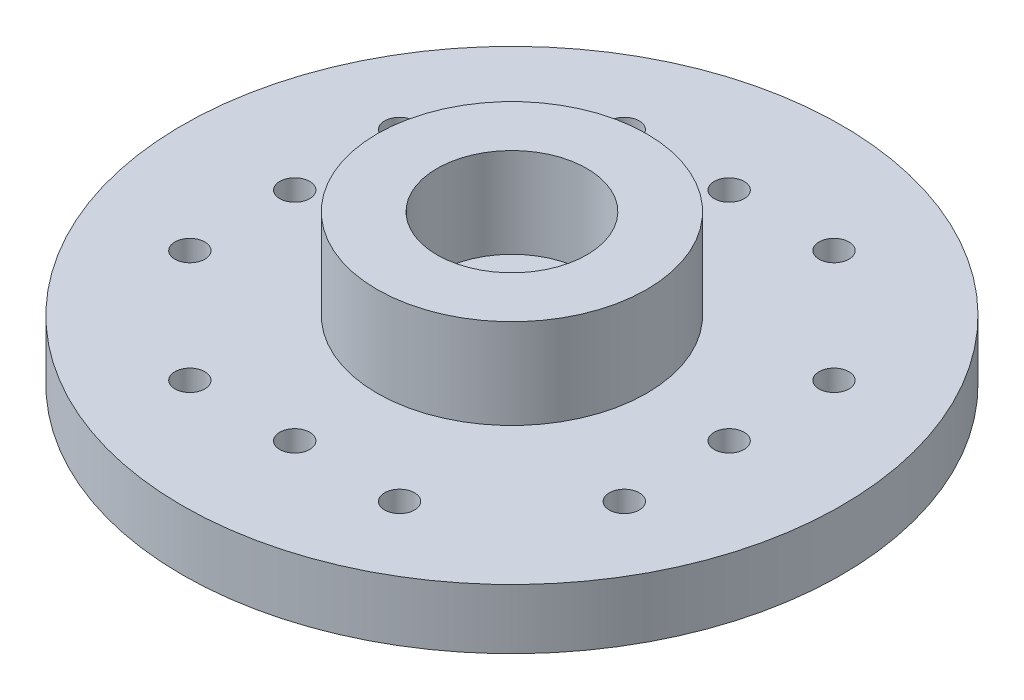
ISO-10303-21;
HEADER;
FILE_DESCRIPTION(('STEP AP214'),'2;1');
FILE_NAME('part.step','',(''),(''),'','','');
FILE_SCHEMA(('AUTOMOTIVE_DESIGN { 1 0 10303 214 1 1 1 1 }'));
ENDSEC;
DATA;
#1=APPLICATION_CONTEXT('core data for automotive mechanical design processes');
#2=APPLICATION_PROTOCOL_DEFINITION('international standard','automotive_design',2000,#1);
#3=PRODUCT_CONTEXT('',#1,'mechanical');
#4=PRODUCT('Part','Part','',(#3));
#5=PRODUCT_RELATED_PRODUCT_CATEGORY('part','',(#4));
#6=PRODUCT_DEFINITION_FORMATION('','',#4);
#7=PRODUCT_DEFINITION_CONTEXT('part definition',#1,'design');
#8=PRODUCT_DEFINITION('design','',#6,#7);
#9=PRODUCT_DEFINITION_SHAPE('','',#8);
#10=(LENGTH_UNIT() NAMED_UNIT(*) SI_UNIT(.MILLI.,.METRE.));
#11=(NAMED_UNIT(*) PLANE_ANGLE_UNIT() SI_UNIT($,.RADIAN.));
#12=(NAMED_UNIT(*) SI_UNIT($,.STERADIAN.) SOLID_ANGLE_UNIT());
#13=UNCERTAINTY_MEASURE_WITH_UNIT(LENGTH_MEASURE(1.E-05),#10,'distance_accuracy_value','');
#14=(GEOMETRIC_REPRESENTATION_CONTEXT(3) GLOBAL_UNCERTAINTY_ASSIGNED_CONTEXT((#13)) GLOBAL_UNIT_ASSIGNED_CONTEXT((#10,
#11,#12)) REPRESENTATION_CONTEXT('',''));
#15=CARTESIAN_POINT('',(0.,0.,0.));
#16=DIRECTION('',(0.,0.,1.));
#17=DIRECTION('',(1.,0.,0.));
#18=AXIS2_PLACEMENT_3D('',#15,#16,#17);
#19=CARTESIAN_POINT('',(0.,2.,0.));
#20=DIRECTION('',(0.,1.,0.));
#21=DIRECTION('',(0.,0.,1.));
#22=AXIS2_PLACEMENT_3D('',#19,#20,#21);
#23=PLANE('',#22);
#24=CARTESIAN_POINT('',(0.,2.,0.));
#25=DIRECTION('',(0.,1.,0.));
#26=DIRECTION('',(0.,0.,1.));
#27=AXIS2_PLACEMENT_3D('',#24,#25,#26);
#28=CIRCLE('',#27,1.5);
#29=CARTESIAN_POINT('',(0.,2.,1.5));
#30=VERTEX_POINT('',#29);
#31=EDGE_CURVE('E47',#30,#30,#28,.T.);
#32=ORIENTED_EDGE('',*,*,#31,.F.);
#33=EDGE_LOOP('',(#32));
#34=FACE_BOUND('',#33,.T.);
#35=CARTESIAN_POINT('',(0.,2.,0.));
#36=DIRECTION('',(0.,1.,0.));
#37=DIRECTION('',(0.,0.,1.));
#38=AXIS2_PLACEMENT_3D('',#35,#36,#37);
#39=CIRCLE('',#38,2.5);
#40=CARTESIAN_POINT('',(0.,2.,2.5));
#41=VERTEX_POINT('',#40);
#42=EDGE_CURVE('E10',#41,#41,#39,.F.);
#43=ORIENTED_EDGE('',*,*,#42,.F.);
#44=EDGE_LOOP('',(#43));
#45=FACE_BOUND('',#44,.T.);
#46=ADVANCED_FACE('F31',(#34,#45),#23,.T.);
#47=CARTESIAN_POINT('',(-7.24999999999996,2.,-3.50000000000008));
#48=DIRECTION('',(0.,1.,0.));
#49=DIRECTION('',(1.,0.,0.));
#50=AXIS2_PLACEMENT_3D('',#47,#48,#49);
#51=CIRCLE('',#50,0.500000000000001);
#52=CARTESIAN_POINT('',(-6.74999999999996,2.,-3.50000000000007));
#53=VERTEX_POINT('',#52);
#54=EDGE_CURVE('E88',#53,#53,#51,.T.);
#55=ORIENTED_EDGE('',*,*,#54,.F.);
#56=EDGE_LOOP('',(#55));
#57=FACE_BOUND('',#56,.T.);
#58=CARTESIAN_POINT('',(-7.25,2.,0.));
#59=DIRECTION('',(0.,1.,0.));
#60=DIRECTION('',(1.,0.,0.));
#61=AXIS2_PLACEMENT_3D('',#58,#59,#60);
#62=CIRCLE('',#61,0.5);
#63=CARTESIAN_POINT('',(-6.75,2.,0.));
#64=VERTEX_POINT('',#63);
#65=EDGE_CURVE('E94',#64,#64,#62,.T.);
#66=ORIENTED_EDGE('',*,*,#65,.F.);
#67=EDGE_LOOP('',(#66));
#68=FACE_BOUND('',#67,.T.);
#69=CARTESIAN_POINT('',(-7.25000000000004,2.,3.49999999999992));
#70=DIRECTION('',(0.,1.,0.));
#71=DIRECTION('',(1.,0.,0.));
#72=AXIS2_PLACEMENT_3D('',#69,#70,#71);
#73=CIRCLE('',#72,0.500000000000001);
#74=CARTESIAN_POINT('',(-6.75000000000004,2.,3.49999999999993));
#75=VERTEX_POINT('',#74);
#76=EDGE_CURVE('E100',#75,#75,#73,.T.);
#77=ORIENTED_EDGE('',*,*,#76,.F.);
#78=EDGE_LOOP('',(#77));
#79=FACE_BOUND('',#78,.T.);
#80=CARTESIAN_POINT('',(-3.5,2.,7.25));
#81=DIRECTION('',(0.,1.,0.));
#82=DIRECTION('',(0.,0.,-1.));
#83=AXIS2_PLACEMENT_3D('',#80,#81,#82);
#84=CIRCLE('',#83,0.500000000000001);
#85=CARTESIAN_POINT('',(-3.5,2.,6.75));
#86=VERTEX_POINT('',#85);
#87=EDGE_CURVE('E106',#86,#86,#84,.T.);
#88=ORIENTED_EDGE('',*,*,#87,.F.);
#89=EDGE_LOOP('',(#88));
#90=FACE_BOUND('',#89,.T.);
#91=CARTESIAN_POINT('',(0.,2.,7.25));
#92=DIRECTION('',(0.,1.,0.));
#93=DIRECTION('',(0.,0.,-1.));
#94=AXIS2_PLACEMENT_3D('',#91,#92,#93);
#95=CIRCLE('',#94,0.5);
#96=CARTESIAN_POINT('',(0.,2.,6.75));
#97=VERTEX_POINT('',#96);
#98=EDGE_CURVE('E112',#97,#97,#95,.T.);
#99=ORIENTED_EDGE('',*,*,#98,.F.);
#100=EDGE_LOOP('',(#99));
#101=FACE_BOUND('',#100,.T.);
#102=CARTESIAN_POINT('',(3.5,2.,7.25));
#103=DIRECTION('',(0.,1.,0.));
#104=DIRECTION('',(0.,0.,-1.));
#105=AXIS2_PLACEMENT_3D('',#102,#103,#104);
#106=CIRCLE('',#105,0.500000000000001);
#107=CARTESIAN_POINT('',(3.5,2.,6.75));
#108=VERTEX_POINT('',#107);
#109=EDGE_CURVE('E118',#108,#108,#106,.T.);
#110=ORIENTED_EDGE('',*,*,#109,.F.);
#111=EDGE_LOOP('',(#110));
#112=FACE_BOUND('',#111,.T.);
#113=CARTESIAN_POINT('',(7.24999999999999,2.,3.50000000000003));
#114=DIRECTION('',(0.,1.,0.));
#115=DIRECTION('',(-1.,0.,0.));
#116=AXIS2_PLACEMENT_3D('',#113,#114,#115);
#117=CIRCLE('',#116,0.500000000000001);
#118=CARTESIAN_POINT('',(6.74999999999999,2.,3.50000000000002));
#119=VERTEX_POINT('',#118);
#120=EDGE_CURVE('E124',#119,#119,#117,.T.);
#121=ORIENTED_EDGE('',*,*,#120,.F.);
#122=EDGE_LOOP('',(#121));
#123=FACE_BOUND('',#122,.T.);
#124=CARTESIAN_POINT('',(7.25,2.,0.));
#125=DIRECTION('',(0.,1.,0.));
#126=DIRECTION('',(-1.,0.,0.));
#127=AXIS2_PLACEMENT_3D('',#124,#125,#126);
#128=CIRCLE('',#127,0.5);
#129=CARTESIAN_POINT('',(6.75,2.,0.));
#130=VERTEX_POINT('',#129);
#131=EDGE_CURVE('E130',#130,#130,#128,.T.);
#132=ORIENTED_EDGE('',*,*,#131,.F.);
#133=EDGE_LOOP('',(#132));
#134=FACE_BOUND('',#133,.T.);
#135=CARTESIAN_POINT('',(7.25000000000001,2.,-3.49999999999998));
#136=DIRECTION('',(0.,1.,0.));
#137=DIRECTION('',(-1.,0.,0.));
#138=AXIS2_PLACEMENT_3D('',#135,#136,#137);
#139=CIRCLE('',#138,0.500000000000001);
#140=CARTESIAN_POINT('',(6.75000000000001,2.,-3.49999999999998));
#141=VERTEX_POINT('',#140);
#142=EDGE_CURVE('E82',#141,#141,#139,.T.);
#143=ORIENTED_EDGE('',*,*,#142,.F.);
#144=EDGE_LOOP('',(#143));
#145=FACE_BOUND('',#144,.T.);
#146=CARTESIAN_POINT('',(-3.5,2.,-7.25));
#147=DIRECTION('',(0.,1.,0.));
#148=DIRECTION('',(0.,0.,1.));
#149=AXIS2_PLACEMENT_3D('',#146,#147,#148);
#150=CIRCLE('',#149,0.500000000000001);
#151=CARTESIAN_POINT('',(-3.5,2.,-6.75));
#152=VERTEX_POINT('',#151);
#153=EDGE_CURVE('E77',#152,#152,#150,.T.);
#154=ORIENTED_EDGE('',*,*,#153,.F.);
#155=EDGE_LOOP('',(#154));
#156=FACE_BOUND('',#155,.T.);
#157=CARTESIAN_POINT('',(0.,2.,-7.25));
#158=DIRECTION('',(0.,1.,0.));
#159=DIRECTION('',(0.,0.,1.));
#160=AXIS2_PLACEMENT_3D('',#157,#158,#159);
#161=CIRCLE('',#160,0.5);
#162=CARTESIAN_POINT('',(0.,2.,-6.75));
#163=VERTEX_POINT('',#162);
#164=EDGE_CURVE('E71',#163,#163,#161,.T.);
#165=ORIENTED_EDGE('',*,*,#164,.F.);
#166=EDGE_LOOP('',(#165));
#167=FACE_BOUND('',#166,.T.);
#168=CARTESIAN_POINT('',(3.5,2.,-7.25));
#169=DIRECTION('',(0.,1.,0.));
#170=DIRECTION('',(0.,0.,1.));
#171=AXIS2_PLACEMENT_3D('',#168,#169,#170);
#172=CIRCLE('',#171,0.500000000000001);
#173=CARTESIAN_POINT('',(3.5,2.,-6.75));
#174=VERTEX_POINT('',#173);
#175=EDGE_CURVE('E64',#174,#174,#172,.T.);
#176=ORIENTED_EDGE('',*,*,#175,.F.);
#177=EDGE_LOOP('',(#176));
#178=FACE_BOUND('',#177,.T.);
#179=CARTESIAN_POINT('',(0.,2.,0.));
#180=DIRECTION('',(0.,1.,0.));
#181=DIRECTION('',(0.,0.,1.));
#182=AXIS2_PLACEMENT_3D('',#179,#180,#181);
#183=CIRCLE('',#182,4.5);
#184=CARTESIAN_POINT('',(0.,2.,4.5));
#185=VERTEX_POINT('',#184);
#186=EDGE_CURVE('E55',#185,#185,#183,.T.);
#187=ORIENTED_EDGE('',*,*,#186,.F.);
#188=EDGE_LOOP('',(#187));
#189=FACE_BOUND('',#188,.T.);
#190=CARTESIAN_POINT('',(0.,2.,0.));
#191=DIRECTION('',(0.,1.,0.));
#192=DIRECTION('',(0.,0.,1.));
#193=AXIS2_PLACEMENT_3D('',#190,#191,#192);
#194=CIRCLE('',#193,11.);
#195=CARTESIAN_POINT('',(0.,2.,11.));
#196=VERTEX_POINT('',#195);
#197=EDGE_CURVE('E38',#196,#196,#194,.T.);
#198=ORIENTED_EDGE('',*,*,#197,.T.);
#199=EDGE_LOOP('',(#198));
#200=FACE_BOUND('',#199,.T.);
#201=ADVANCED_FACE('F147',(#57,#68,#79,#90,#101,#112,#123,#134,#145,#156,#167,#178,#189,#200),
#23,.T.);
#202=CARTESIAN_POINT('',(0.,0.,0.));
#203=DIRECTION('',(0.,1.,0.));
#204=DIRECTION('',(0.,0.,1.));
#205=AXIS2_PLACEMENT_3D('',#202,#203,#204);
#206=PLANE('',#205);
#207=CARTESIAN_POINT('',(-7.24999999999996,0.,-3.50000000000008));
#208=DIRECTION('',(0.,1.,0.));
#209=DIRECTION('',(1.,0.,0.));
#210=AXIS2_PLACEMENT_3D('',#207,#208,#209);
#211=CIRCLE('',#210,0.500000000000001);
#212=CARTESIAN_POINT('',(-6.74999999999996,0.,-3.50000000000007));
#213=VERTEX_POINT('',#212);
#214=EDGE_CURVE('E91',#213,#213,#211,.T.);
#215=ORIENTED_EDGE('',*,*,#214,.T.);
#216=EDGE_LOOP('',(#215));
#217=FACE_BOUND('',#216,.T.);
#218=CARTESIAN_POINT('',(-7.25,0.,0.));
#219=DIRECTION('',(0.,1.,0.));
#220=DIRECTION('',(1.,0.,0.));
#221=AXIS2_PLACEMENT_3D('',#218,#219,#220);
#222=CIRCLE('',#221,0.5);
#223=CARTESIAN_POINT('',(-6.75,0.,0.));
#224=VERTEX_POINT('',#223);
#225=EDGE_CURVE('E97',#224,#224,#222,.T.);
#226=ORIENTED_EDGE('',*,*,#225,.T.);
#227=EDGE_LOOP('',(#226));
#228=FACE_BOUND('',#227,.T.);
#229=CARTESIAN_POINT('',(-7.25000000000004,0.,3.49999999999992));
#230=DIRECTION('',(0.,1.,0.));
#231=DIRECTION('',(1.,0.,0.));
#232=AXIS2_PLACEMENT_3D('',#229,#230,#231);
#233=CIRCLE('',#232,0.500000000000001);
#234=CARTESIAN_POINT('',(-6.75000000000004,0.,3.49999999999993));
#235=VERTEX_POINT('',#234);
#236=EDGE_CURVE('E103',#235,#235,#233,.T.);
#237=ORIENTED_EDGE('',*,*,#236,.T.);
#238=EDGE_LOOP('',(#237));
#239=FACE_BOUND('',#238,.T.);
#240=CARTESIAN_POINT('',(-3.5,0.,7.25));
#241=DIRECTION('',(0.,1.,0.));
#242=DIRECTION('',(0.,0.,-1.));
#243=AXIS2_PLACEMENT_3D('',#240,#241,#242);
#244=CIRCLE('',#243,0.500000000000001);
#245=CARTESIAN_POINT('',(-3.5,0.,6.75));
#246=VERTEX_POINT('',#245);
#247=EDGE_CURVE('E109',#246,#246,#244,.T.);
#248=ORIENTED_EDGE('',*,*,#247,.T.);
#249=EDGE_LOOP('',(#248));
#250=FACE_BOUND('',#249,.T.);
#251=CARTESIAN_POINT('',(0.,0.,7.25));
#252=DIRECTION('',(0.,1.,0.));
#253=DIRECTION('',(0.,0.,-1.));
#254=AXIS2_PLACEMENT_3D('',#251,#252,#253);
#255=CIRCLE('',#254,0.5);
#256=CARTESIAN_POINT('',(0.,0.,6.75));
#257=VERTEX_POINT('',#256);
#258=EDGE_CURVE('E115',#257,#257,#255,.T.);
#259=ORIENTED_EDGE('',*,*,#258,.T.);
#260=EDGE_LOOP('',(#259));
#261=FACE_BOUND('',#260,.T.);
#262=CARTESIAN_POINT('',(3.5,0.,7.25));
#263=DIRECTION('',(0.,1.,0.));
#264=DIRECTION('',(0.,0.,-1.));
#265=AXIS2_PLACEMENT_3D('',#262,#263,#264);
#266=CIRCLE('',#265,0.500000000000001);
#267=CARTESIAN_POINT('',(3.5,0.,6.75));
#268=VERTEX_POINT('',#267);
#269=EDGE_CURVE('E121',#268,#268,#266,.T.);
#270=ORIENTED_EDGE('',*,*,#269,.T.);
#271=EDGE_LOOP('',(#270));
#272=FACE_BOUND('',#271,.T.);
#273=CARTESIAN_POINT('',(7.24999999999999,0.,3.50000000000003));
#274=DIRECTION('',(0.,1.,0.));
#275=DIRECTION('',(-1.,0.,0.));
#276=AXIS2_PLACEMENT_3D('',#273,#274,#275);
#277=CIRCLE('',#276,0.500000000000001);
#278=CARTESIAN_POINT('',(6.74999999999999,0.,3.50000000000002));
#279=VERTEX_POINT('',#278);
#280=EDGE_CURVE('E127',#279,#279,#277,.T.);
#281=ORIENTED_EDGE('',*,*,#280,.T.);
#282=EDGE_LOOP('',(#281));
#283=FACE_BOUND('',#282,.T.);
#284=CARTESIAN_POINT('',(7.25,0.,0.));
#285=DIRECTION('',(0.,1.,0.));
#286=DIRECTION('',(-1.,0.,0.));
#287=AXIS2_PLACEMENT_3D('',#284,#285,#286);
#288=CIRCLE('',#287,0.5);
#289=CARTESIAN_POINT('',(6.75,0.,0.));
#290=VERTEX_POINT('',#289);
#291=EDGE_CURVE('E85',#290,#290,#288,.T.);
#292=ORIENTED_EDGE('',*,*,#291,.T.);
#293=EDGE_LOOP('',(#292));
#294=FACE_BOUND('',#293,.T.);
#295=CARTESIAN_POINT('',(7.25000000000001,0.,-3.49999999999998));
#296=DIRECTION('',(0.,1.,0.));
#297=DIRECTION('',(-1.,0.,0.));
#298=AXIS2_PLACEMENT_3D('',#295,#296,#297);
#299=CIRCLE('',#298,0.500000000000001);
#300=CARTESIAN_POINT('',(6.75000000000001,0.,-3.49999999999998));
#301=VERTEX_POINT('',#300);
#302=EDGE_CURVE('E68',#301,#301,#299,.T.);
#303=ORIENTED_EDGE('',*,*,#302,.T.);
#304=EDGE_LOOP('',(#303));
#305=FACE_BOUND('',#304,.T.);
#306=CARTESIAN_POINT('',(-3.5,0.,-7.25));
#307=DIRECTION('',(0.,1.,0.));
#308=DIRECTION('',(0.,0.,1.));
#309=AXIS2_PLACEMENT_3D('',#306,#307,#308);
#310=CIRCLE('',#309,0.500000000000001);
#311=CARTESIAN_POINT('',(-3.5,0.,-6.75));
#312=VERTEX_POINT('',#311);
#313=EDGE_CURVE('E63',#312,#312,#310,.T.);
#314=ORIENTED_EDGE('',*,*,#313,.T.);
#315=EDGE_LOOP('',(#314));
#316=FACE_BOUND('',#315,.T.);
#317=CARTESIAN_POINT('',(0.,0.,-7.25));
#318=DIRECTION('',(0.,1.,0.));
#319=DIRECTION('',(0.,0.,1.));
#320=AXIS2_PLACEMENT_3D('',#317,#318,#319);
#321=CIRCLE('',#320,0.5);
#322=CARTESIAN_POINT('',(0.,0.,-6.75));
#323=VERTEX_POINT('',#322);
#324=EDGE_CURVE('E74',#323,#323,#321,.T.);
#325=ORIENTED_EDGE('',*,*,#324,.T.);
#326=EDGE_LOOP('',(#325));
#327=FACE_BOUND('',#326,.T.);
#328=CARTESIAN_POINT('',(3.5,0.,-7.25));
#329=DIRECTION('',(0.,1.,0.));
#330=DIRECTION('',(0.,0.,1.));
#331=AXIS2_PLACEMENT_3D('',#328,#329,#330);
#332=CIRCLE('',#331,0.500000000000001);
#333=CARTESIAN_POINT('',(3.5,0.,-6.75));
#334=VERTEX_POINT('',#333);
#335=EDGE_CURVE('E67',#334,#334,#332,.T.);
#336=ORIENTED_EDGE('',*,*,#335,.T.);
#337=EDGE_LOOP('',(#336));
#338=FACE_BOUND('',#337,.T.);
#339=CARTESIAN_POINT('',(0.,0.,0.));
#340=DIRECTION('',(0.,1.,0.));
#341=DIRECTION('',(0.,0.,1.));
#342=AXIS2_PLACEMENT_3D('',#339,#340,#341);
#343=CIRCLE('',#342,11.);
#344=CARTESIAN_POINT('',(0.,0.,11.));
#345=VERTEX_POINT('',#344);
#346=EDGE_CURVE('E42',#345,#345,#343,.T.);
#347=ORIENTED_EDGE('',*,*,#346,.F.);
#348=EDGE_LOOP('',(#347));
#349=FACE_BOUND('',#348,.T.);
#350=CARTESIAN_POINT('',(0.,0.,0.));
#351=DIRECTION('',(0.,1.,0.));
#352=DIRECTION('',(0.,0.,1.));
#353=AXIS2_PLACEMENT_3D('',#350,#351,#352);
#354=CIRCLE('',#353,1.5);
#355=CARTESIAN_POINT('',(0.,0.,1.5));
#356=VERTEX_POINT('',#355);
#357=EDGE_CURVE('E49',#356,#356,#354,.T.);
#358=ORIENTED_EDGE('',*,*,#357,.T.);
#359=EDGE_LOOP('',(#358));
#360=FACE_BOUND('',#359,.T.);
#361=ADVANCED_FACE('F136',(#217,#228,#239,#250,#261,#272,#283,#294,#305,#316,#327,#338,#349,
#360),#206,.F.);
#362=CARTESIAN_POINT('',(0.,2.,0.));
#363=DIRECTION('',(0.,-1.,0.));
#364=DIRECTION('',(0.,0.,-1.));
#365=AXIS2_PLACEMENT_3D('',#362,#363,#364);
#366=CYLINDRICAL_SURFACE('',#365,11.);
#367=ORIENTED_EDGE('',*,*,#197,.F.);
#368=EDGE_LOOP('',(#367));
#369=FACE_BOUND('',#368,.T.);
#370=ORIENTED_EDGE('',*,*,#346,.T.);
#371=EDGE_LOOP('',(#370));
#372=FACE_BOUND('',#371,.T.);
#373=ADVANCED_FACE('F33',(#369,#372),#366,.T.);
#374=CARTESIAN_POINT('',(0.,2.,0.));
#375=DIRECTION('',(0.,-1.,0.));
#376=DIRECTION('',(0.,0.,-1.));
#377=AXIS2_PLACEMENT_3D('',#374,#375,#376);
#378=CYLINDRICAL_SURFACE('',#377,1.5);
#379=ORIENTED_EDGE('',*,*,#31,.T.);
#380=EDGE_LOOP('',(#379));
#381=FACE_BOUND('',#380,.T.);
#382=ORIENTED_EDGE('',*,*,#357,.F.);
#383=EDGE_LOOP('',(#382));
#384=FACE_BOUND('',#383,.T.);
#385=ADVANCED_FACE('F175',(#381,#384),#378,.F.);
#386=CARTESIAN_POINT('',(0.,5.,0.));
#387=DIRECTION('',(0.,1.,0.));
#388=DIRECTION('',(0.,0.,1.));
#389=AXIS2_PLACEMENT_3D('',#386,#387,#388);
#390=PLANE('',#389);
#391=CARTESIAN_POINT('',(0.,5.,0.));
#392=DIRECTION('',(0.,1.,0.));
#393=DIRECTION('',(0.,0.,1.));
#394=AXIS2_PLACEMENT_3D('',#391,#392,#393);
#395=CIRCLE('',#394,4.5);
#396=CARTESIAN_POINT('',(0.,5.,4.5));
#397=VERTEX_POINT('',#396);
#398=EDGE_CURVE('E52',#397,#397,#395,.T.);
#399=ORIENTED_EDGE('',*,*,#398,.T.);
#400=EDGE_LOOP('',(#399));
#401=FACE_BOUND('',#400,.T.);
#402=CARTESIAN_POINT('',(0.,5.,0.));
#403=DIRECTION('',(0.,1.,0.));
#404=DIRECTION('',(0.,0.,1.));
#405=AXIS2_PLACEMENT_3D('',#402,#403,#404);
#406=CIRCLE('',#405,2.5);
#407=CARTESIAN_POINT('',(0.,5.,2.5));
#408=VERTEX_POINT('',#407);
#409=EDGE_CURVE('E58',#408,#408,#406,.T.);
#410=ORIENTED_EDGE('',*,*,#409,.F.);
#411=EDGE_LOOP('',(#410));
#412=FACE_BOUND('',#411,.T.);
#413=ADVANCED_FACE('F165',(#401,#412),#390,.T.);
#414=CARTESIAN_POINT('',(0.,5.,0.));
#415=DIRECTION('',(0.,-1.,0.));
#416=DIRECTION('',(0.,0.,-1.));
#417=AXIS2_PLACEMENT_3D('',#414,#415,#416);
#418=CYLINDRICAL_SURFACE('',#417,4.5);
#419=ORIENTED_EDGE('',*,*,#398,.F.);
#420=EDGE_LOOP('',(#419));
#421=FACE_BOUND('',#420,.T.);
#422=ORIENTED_EDGE('',*,*,#186,.T.);
#423=EDGE_LOOP('',(#422));
#424=FACE_BOUND('',#423,.T.);
#425=ADVANCED_FACE('F162',(#421,#424),#418,.T.);
#426=CARTESIAN_POINT('',(0.,5.,0.));
#427=DIRECTION('',(0.,-1.,0.));
#428=DIRECTION('',(0.,0.,-1.));
#429=AXIS2_PLACEMENT_3D('',#426,#427,#428);
#430=CYLINDRICAL_SURFACE('',#429,2.5);
#431=ORIENTED_EDGE('',*,*,#409,.T.);
#432=EDGE_LOOP('',(#431));
#433=FACE_BOUND('',#432,.T.);
#434=ORIENTED_EDGE('',*,*,#42,.T.);
#435=EDGE_LOOP('',(#434));
#436=FACE_BOUND('',#435,.T.);
#437=ADVANCED_FACE('F164',(#433,#436),#430,.F.);
#438=CARTESIAN_POINT('',(3.5,0.,-7.25));
#439=DIRECTION('',(0.,1.,0.));
#440=DIRECTION('',(0.,0.,1.));
#441=AXIS2_PLACEMENT_3D('',#438,#439,#440);
#442=CYLINDRICAL_SURFACE('',#441,0.500000000000001);
#443=ORIENTED_EDGE('',*,*,#335,.F.);
#444=EDGE_LOOP('',(#443));
#445=FACE_BOUND('',#444,.T.);
#446=ORIENTED_EDGE('',*,*,#175,.T.);
#447=EDGE_LOOP('',(#446));
#448=FACE_BOUND('',#447,.T.);
#449=ADVANCED_FACE('F172',(#445,#448),#442,.F.);
#450=CARTESIAN_POINT('',(0.,0.,-7.25));
#451=DIRECTION('',(0.,1.,0.));
#452=DIRECTION('',(0.,0.,1.));
#453=AXIS2_PLACEMENT_3D('',#450,#451,#452);
#454=CYLINDRICAL_SURFACE('',#453,0.5);
#455=ORIENTED_EDGE('',*,*,#324,.F.);
#456=EDGE_LOOP('',(#455));
#457=FACE_BOUND('',#456,.T.);
#458=ORIENTED_EDGE('',*,*,#164,.T.);
#459=EDGE_LOOP('',(#458));
#460=FACE_BOUND('',#459,.T.);
#461=ADVANCED_FACE('F246',(#457,#460),#454,.F.);
#462=CARTESIAN_POINT('',(-3.5,0.,-7.25));
#463=DIRECTION('',(0.,1.,0.));
#464=DIRECTION('',(0.,0.,1.));
#465=AXIS2_PLACEMENT_3D('',#462,#463,#464);
#466=CYLINDRICAL_SURFACE('',#465,0.500000000000001);
#467=ORIENTED_EDGE('',*,*,#313,.F.);
#468=EDGE_LOOP('',(#467));
#469=FACE_BOUND('',#468,.T.);
#470=ORIENTED_EDGE('',*,*,#153,.T.);
#471=EDGE_LOOP('',(#470));
#472=FACE_BOUND('',#471,.T.);
#473=ADVANCED_FACE('F242',(#469,#472),#466,.F.);
#474=CARTESIAN_POINT('',(7.25000000000001,0.,-3.49999999999998));
#475=DIRECTION('',(0.,1.,0.));
#476=DIRECTION('',(0.,0.,1.));
#477=AXIS2_PLACEMENT_3D('',#474,#475,#476);
#478=CYLINDRICAL_SURFACE('',#477,0.500000000000001);
#479=ORIENTED_EDGE('',*,*,#302,.F.);
#480=EDGE_LOOP('',(#479));
#481=FACE_BOUND('',#480,.T.);
#482=ORIENTED_EDGE('',*,*,#142,.T.);
#483=EDGE_LOOP('',(#482));
#484=FACE_BOUND('',#483,.T.);
#485=ADVANCED_FACE('F143',(#481,#484),#478,.F.);
#486=CARTESIAN_POINT('',(7.25,0.,0.));
#487=DIRECTION('',(0.,1.,0.));
#488=DIRECTION('',(0.,0.,1.));
#489=AXIS2_PLACEMENT_3D('',#486,#487,#488);
#490=CYLINDRICAL_SURFACE('',#489,0.5);
#491=ORIENTED_EDGE('',*,*,#291,.F.);
#492=EDGE_LOOP('',(#491));
#493=FACE_BOUND('',#492,.T.);
#494=ORIENTED_EDGE('',*,*,#131,.T.);
#495=EDGE_LOOP('',(#494));
#496=FACE_BOUND('',#495,.T.);
#497=ADVANCED_FACE('F139',(#493,#496),#490,.F.);
#498=CARTESIAN_POINT('',(7.24999999999999,0.,3.50000000000003));
#499=DIRECTION('',(0.,1.,0.));
#500=DIRECTION('',(0.,0.,1.));
#501=AXIS2_PLACEMENT_3D('',#498,#499,#500);
#502=CYLINDRICAL_SURFACE('',#501,0.500000000000001);
#503=ORIENTED_EDGE('',*,*,#280,.F.);
#504=EDGE_LOOP('',(#503));
#505=FACE_BOUND('',#504,.T.);
#506=ORIENTED_EDGE('',*,*,#120,.T.);
#507=EDGE_LOOP('',(#506));
#508=FACE_BOUND('',#507,.T.);
#509=ADVANCED_FACE('F142',(#505,#508),#502,.F.);
#510=CARTESIAN_POINT('',(3.5,0.,7.25));
#511=DIRECTION('',(0.,1.,0.));
#512=DIRECTION('',(0.,0.,1.));
#513=AXIS2_PLACEMENT_3D('',#510,#511,#512);
#514=CYLINDRICAL_SURFACE('',#513,0.500000000000001);
#515=ORIENTED_EDGE('',*,*,#269,.F.);
#516=EDGE_LOOP('',(#515));
#517=FACE_BOUND('',#516,.T.);
#518=ORIENTED_EDGE('',*,*,#109,.T.);
#519=EDGE_LOOP('',(#518));
#520=FACE_BOUND('',#519,.T.);
#521=ADVANCED_FACE('F210',(#517,#520),#514,.F.);
#522=CARTESIAN_POINT('',(0.,0.,7.25));
#523=DIRECTION('',(0.,1.,0.));
#524=DIRECTION('',(0.,0.,1.));
#525=AXIS2_PLACEMENT_3D('',#522,#523,#524);
#526=CYLINDRICAL_SURFACE('',#525,0.5);
#527=ORIENTED_EDGE('',*,*,#258,.F.);
#528=EDGE_LOOP('',(#527));
#529=FACE_BOUND('',#528,.T.);
#530=ORIENTED_EDGE('',*,*,#98,.T.);
#531=EDGE_LOOP('',(#530));
#532=FACE_BOUND('',#531,.T.);
#533=ADVANCED_FACE('F217',(#529,#532),#526,.F.);
#534=CARTESIAN_POINT('',(-3.5,0.,7.25));
#535=DIRECTION('',(0.,1.,0.));
#536=DIRECTION('',(0.,0.,1.));
#537=AXIS2_PLACEMENT_3D('',#534,#535,#536);
#538=CYLINDRICAL_SURFACE('',#537,0.500000000000001);
#539=ORIENTED_EDGE('',*,*,#247,.F.);
#540=EDGE_LOOP('',(#539));
#541=FACE_BOUND('',#540,.T.);
#542=ORIENTED_EDGE('',*,*,#87,.T.);
#543=EDGE_LOOP('',(#542));
#544=FACE_BOUND('',#543,.T.);
#545=ADVANCED_FACE('F223',(#541,#544),#538,.F.);
#546=CARTESIAN_POINT('',(-7.25000000000004,0.,3.49999999999992));
#547=DIRECTION('',(0.,1.,0.));
#548=DIRECTION('',(0.,0.,1.));
#549=AXIS2_PLACEMENT_3D('',#546,#547,#548);
#550=CYLINDRICAL_SURFACE('',#549,0.500000000000001);
#551=ORIENTED_EDGE('',*,*,#236,.F.);
#552=EDGE_LOOP('',(#551));
#553=FACE_BOUND('',#552,.T.);
#554=ORIENTED_EDGE('',*,*,#76,.T.);
#555=EDGE_LOOP('',(#554));
#556=FACE_BOUND('',#555,.T.);
#557=ADVANCED_FACE('F227',(#553,#556),#550,.F.);
#558=CARTESIAN_POINT('',(-7.25,0.,0.));
#559=DIRECTION('',(0.,1.,0.));
#560=DIRECTION('',(0.,0.,1.));
#561=AXIS2_PLACEMENT_3D('',#558,#559,#560);
#562=CYLINDRICAL_SURFACE('',#561,0.5);
#563=ORIENTED_EDGE('',*,*,#225,.F.);
#564=EDGE_LOOP('',(#563));
#565=FACE_BOUND('',#564,.T.);
#566=ORIENTED_EDGE('',*,*,#65,.T.);
#567=EDGE_LOOP('',(#566));
#568=FACE_BOUND('',#567,.T.);
#569=ADVANCED_FACE('F231',(#565,#568),#562,.F.);
#570=CARTESIAN_POINT('',(-7.24999999999996,0.,-3.50000000000008));
#571=DIRECTION('',(0.,1.,0.));
#572=DIRECTION('',(0.,0.,1.));
#573=AXIS2_PLACEMENT_3D('',#570,#571,#572);
#574=CYLINDRICAL_SURFACE('',#573,0.500000000000001);
#575=ORIENTED_EDGE('',*,*,#214,.F.);
#576=EDGE_LOOP('',(#575));
#577=FACE_BOUND('',#576,.T.);
#578=ORIENTED_EDGE('',*,*,#54,.T.);
#579=EDGE_LOOP('',(#578));
#580=FACE_BOUND('',#579,.T.);
#581=ADVANCED_FACE('F235',(#577,#580),#574,.F.);
#582=CLOSED_SHELL('',(#46,#201,#361,#373,#385,#413,#425,#437,#449,#461,#473,#485,#497,#509,#521,
#533,#545,#557,#569,#581));
#583=MANIFOLD_SOLID_BREP('B2',#582);
#584=ADVANCED_BREP_SHAPE_REPRESENTATION('',(#18,#583),#14);
#585=SHAPE_DEFINITION_REPRESENTATION(#9,#584);
ENDSEC;
END-ISO-10303-21;
